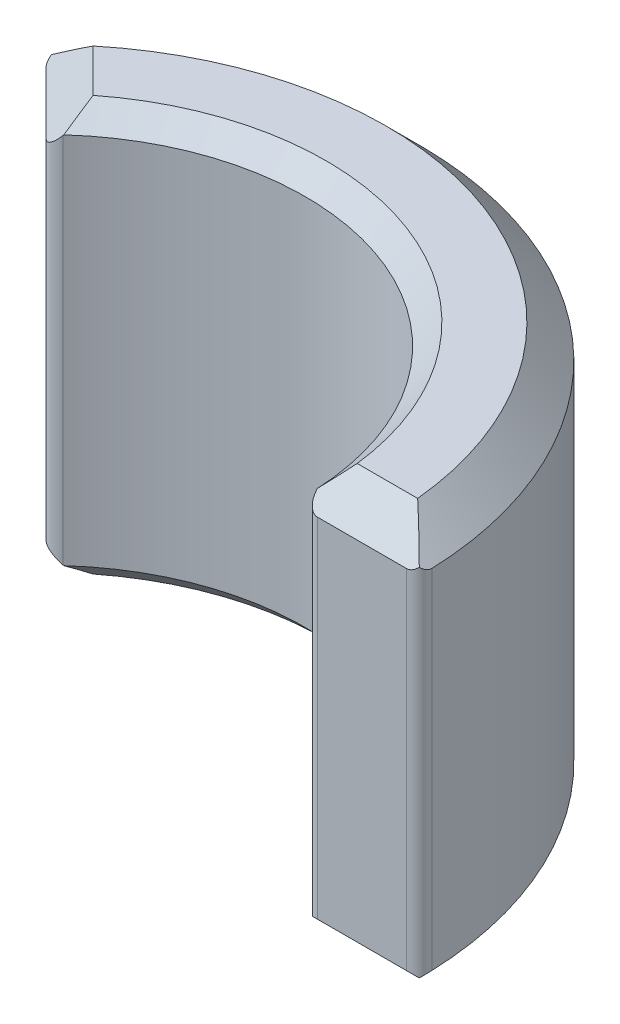
ISO-10303-21;
HEADER;
FILE_DESCRIPTION(('STEP AP214'),'2;1');
FILE_NAME('part.step','',(''),(''),'','','');
FILE_SCHEMA(('AUTOMOTIVE_DESIGN { 1 0 10303 214 1 1 1 1 }'));
ENDSEC;
DATA;
#1=APPLICATION_CONTEXT('core data for automotive mechanical design processes');
#2=APPLICATION_PROTOCOL_DEFINITION('international standard','automotive_design',2000,#1);
#3=PRODUCT_CONTEXT('',#1,'mechanical');
#4=PRODUCT('Part','Part','',(#3));
#5=PRODUCT_RELATED_PRODUCT_CATEGORY('part','',(#4));
#6=PRODUCT_DEFINITION_FORMATION('','',#4);
#7=PRODUCT_DEFINITION_CONTEXT('part definition',#1,'design');
#8=PRODUCT_DEFINITION('design','',#6,#7);
#9=PRODUCT_DEFINITION_SHAPE('','',#8);
#10=(LENGTH_UNIT() NAMED_UNIT(*) SI_UNIT(.MILLI.,.METRE.));
#11=(NAMED_UNIT(*) PLANE_ANGLE_UNIT() SI_UNIT($,.RADIAN.));
#12=(NAMED_UNIT(*) SI_UNIT($,.STERADIAN.) SOLID_ANGLE_UNIT());
#13=UNCERTAINTY_MEASURE_WITH_UNIT(LENGTH_MEASURE(1.E-05),#10,'distance_accuracy_value','');
#14=(GEOMETRIC_REPRESENTATION_CONTEXT(3) GLOBAL_UNCERTAINTY_ASSIGNED_CONTEXT((#13)) GLOBAL_UNIT_ASSIGNED_CONTEXT((#10,
#11,#12)) REPRESENTATION_CONTEXT('',''));
#15=CARTESIAN_POINT('',(0.,0.,0.));
#16=DIRECTION('',(0.,0.,1.));
#17=DIRECTION('',(1.,0.,0.));
#18=AXIS2_PLACEMENT_3D('',#15,#16,#17);
#19=CARTESIAN_POINT('',(-25.2874213562373,12.7,-1.31950983888535E-13));
#20=DIRECTION('',(0.,0.,-1.));
#21=DIRECTION('',(-1.,0.,0.));
#22=AXIS2_PLACEMENT_3D('',#19,#20,#21);
#23=PLANE('',#22);
#24=DIRECTION('',(-1.,0.,0.));
#25=VECTOR('',#24,1.);
#26=CARTESIAN_POINT('',(7.9375,11.684,0.));
#27=LINE('',#26,#25);
#28=CARTESIAN_POINT('',(11.0424290805964,11.684,0.));
#29=VERTEX_POINT('',#28);
#30=CARTESIAN_POINT('',(8.30977022847202,11.684,0.));
#31=VERTEX_POINT('',#30);
#32=EDGE_CURVE('E192',#29,#31,#27,.T.);
#33=ORIENTED_EDGE('',*,*,#32,.T.);
#34=DIRECTION('',(0.,1.,0.));
#35=VECTOR('',#34,1.);
#36=CARTESIAN_POINT('',(8.30977022847202,1.016,0.));
#37=LINE('',#36,#35);
#38=CARTESIAN_POINT('',(8.30977022847203,1.016,0.));
#39=VERTEX_POINT('',#38);
#40=EDGE_CURVE('E501',#31,#39,#37,.F.);
#41=ORIENTED_EDGE('',*,*,#40,.T.);
#42=DIRECTION('',(1.,0.,0.));
#43=VECTOR('',#42,1.);
#44=CARTESIAN_POINT('',(-25.2874213562373,1.016,-1.31950983888535E-13));
#45=LINE('',#44,#43);
#46=CARTESIAN_POINT('',(11.0424290805964,1.016,0.));
#47=VERTEX_POINT('',#46);
#48=EDGE_CURVE('E195',#39,#47,#45,.T.);
#49=ORIENTED_EDGE('',*,*,#48,.T.);
#50=DIRECTION('',(0.,-1.,0.));
#51=VECTOR('',#50,1.);
#52=CARTESIAN_POINT('',(11.0424290805964,12.7,0.));
#53=LINE('',#52,#51);
#54=EDGE_CURVE('E275',#47,#29,#53,.F.);
#55=ORIENTED_EDGE('',*,*,#54,.T.);
#56=EDGE_LOOP('',(#33,#41,#49,#55));
#57=FACE_BOUND('',#56,.T.);
#58=ADVANCED_FACE('F34',(#57),#23,.F.);
#59=CARTESIAN_POINT('',(0.,12.7,0.));
#60=DIRECTION('',(0.,-1.,0.));
#61=DIRECTION('',(0.,0.,-1.));
#62=AXIS2_PLACEMENT_3D('',#59,#60,#61);
#63=CYLINDRICAL_SURFACE('',#62,11.43);
#64=CARTESIAN_POINT('',(0.,11.684,0.));
#65=DIRECTION('',(0.,1.,0.));
#66=DIRECTION('',(0.,0.,1.));
#67=AXIS2_PLACEMENT_3D('',#64,#65,#66);
#68=CIRCLE('',#67,11.43);
#69=CARTESIAN_POINT('',(-7.79872634485773,11.684,-8.35612155237237));
#70=VERTEX_POINT('',#69);
#71=CARTESIAN_POINT('',(11.4232024971686,11.684,-0.394137931034423));
#72=VERTEX_POINT('',#71);
#73=EDGE_CURVE('E198',#70,#72,#68,.F.);
#74=ORIENTED_EDGE('',*,*,#73,.T.);
#75=DIRECTION('',(0.,-1.,0.));
#76=VECTOR('',#75,1.);
#77=CARTESIAN_POINT('',(11.4232024971686,12.7,-0.394137931034423));
#78=LINE('',#77,#76);
#79=CARTESIAN_POINT('',(11.4232024971686,1.016,-0.394137931034423));
#80=VERTEX_POINT('',#79);
#81=EDGE_CURVE('E343',#72,#80,#78,.T.);
#82=ORIENTED_EDGE('',*,*,#81,.T.);
#83=CARTESIAN_POINT('',(0.,1.016,0.));
#84=DIRECTION('',(0.,1.,0.));
#85=DIRECTION('',(0.,0.,1.));
#86=AXIS2_PLACEMENT_3D('',#83,#84,#85);
#87=CIRCLE('',#86,11.43);
#88=CARTESIAN_POINT('',(-7.79872634485773,1.016,-8.35612155237237));
#89=VERTEX_POINT('',#88);
#90=EDGE_CURVE('E201',#80,#89,#87,.T.);
#91=ORIENTED_EDGE('',*,*,#90,.T.);
#92=DIRECTION('',(0.,-1.,0.));
#93=VECTOR('',#92,1.);
#94=CARTESIAN_POINT('',(-7.79872634485773,12.7,-8.35612155237237));
#95=LINE('',#94,#93);
#96=EDGE_CURVE('E341',#89,#70,#95,.F.);
#97=ORIENTED_EDGE('',*,*,#96,.T.);
#98=EDGE_LOOP('',(#74,#82,#91,#97));
#99=FACE_BOUND('',#98,.T.);
#100=ADVANCED_FACE('F374',(#99),#63,.T.);
#101=CARTESIAN_POINT('',(-12.6437106781187,12.7,-12.6437106781187));
#102=DIRECTION('',(-0.707106781186548,0.,0.707106781186548));
#103=DIRECTION('',(0.707106781186548,0.,0.707106781186548));
#104=AXIS2_PLACEMENT_3D('',#101,#102,#103);
#105=PLANE('',#104);
#106=DIRECTION('',(-0.707106781186548,0.,-0.707106781186548));
#107=VECTOR('',#106,1.);
#108=CARTESIAN_POINT('',(-12.6437106781187,11.684,-12.6437106781187));
#109=LINE('',#108,#107);
#110=CARTESIAN_POINT('',(-5.87589487865465,11.684,-5.87589487865465));
#111=VERTEX_POINT('',#110);
#112=CARTESIAN_POINT('',(-7.80817648366121,11.684,-7.80817648366121));
#113=VERTEX_POINT('',#112);
#114=EDGE_CURVE('E169',#111,#113,#109,.T.);
#115=ORIENTED_EDGE('',*,*,#114,.T.);
#116=DIRECTION('',(0.,1.,0.));
#117=VECTOR('',#116,1.);
#118=CARTESIAN_POINT('',(-7.80817648366121,1.016,-7.80817648366122));
#119=LINE('',#118,#117);
#120=CARTESIAN_POINT('',(-7.80817648366121,1.016,-7.80817648366121));
#121=VERTEX_POINT('',#120);
#122=EDGE_CURVE('E321',#113,#121,#119,.F.);
#123=ORIENTED_EDGE('',*,*,#122,.T.);
#124=DIRECTION('',(0.707106781186548,0.,0.707106781186548));
#125=VECTOR('',#124,1.);
#126=CARTESIAN_POINT('',(-5.61266007566822,1.016,-5.61266007566822));
#127=LINE('',#126,#125);
#128=CARTESIAN_POINT('',(-5.87589487865465,1.016,-5.87589487865465));
#129=VERTEX_POINT('',#128);
#130=EDGE_CURVE('E180',#121,#129,#127,.T.);
#131=ORIENTED_EDGE('',*,*,#130,.T.);
#132=DIRECTION('',(0.,-1.,0.));
#133=VECTOR('',#132,1.);
#134=CARTESIAN_POINT('',(-5.87589487865466,12.7,-5.87589487865466));
#135=LINE('',#134,#133);
#136=EDGE_CURVE('E54',#129,#111,#135,.F.);
#137=ORIENTED_EDGE('',*,*,#136,.T.);
#138=EDGE_LOOP('',(#115,#123,#131,#137));
#139=FACE_BOUND('',#138,.T.);
#140=ADVANCED_FACE('F324',(#139),#105,.T.);
#141=CARTESIAN_POINT('',(0.,12.7,0.));
#142=DIRECTION('',(0.,-1.,0.));
#143=DIRECTION('',(0.,0.,-1.));
#144=AXIS2_PLACEMENT_3D('',#141,#142,#143);
#145=CYLINDRICAL_SURFACE('',#144,7.9375);
#146=CARTESIAN_POINT('',(0.,1.016,0.));
#147=DIRECTION('',(0.,0.707106781186549,-0.707106781186546));
#148=DIRECTION('',(0.,-0.707106781186546,-0.707106781186549));
#149=AXIS2_PLACEMENT_3D('',#146,#147,#148);
#150=ELLIPSE('',#149,11.2253201513364,7.9375);
#151=CARTESIAN_POINT('',(7.92835072697973,0.635000000000002,-0.380999999999959));
#152=VERTEX_POINT('',#151);
#153=CARTESIAN_POINT('',(7.9291700653359,0.652450381679392,-0.363549618320569));
#154=VERTEX_POINT('',#153);
#155=EDGE_CURVE('E187',#152,#154,#150,.F.);
#156=ORIENTED_EDGE('',*,*,#155,.T.);
#157=DIRECTION('',(0.,-1.,0.));
#158=VECTOR('',#157,1.);
#159=CARTESIAN_POINT('',(7.9291700653359,12.7,-0.363549618320569));
#160=LINE('',#159,#158);
#161=CARTESIAN_POINT('',(7.9291700653359,12.0475496183206,-0.36354961832057));
#162=VERTEX_POINT('',#161);
#163=EDGE_CURVE('E511',#154,#162,#160,.F.);
#164=ORIENTED_EDGE('',*,*,#163,.T.);
#165=CARTESIAN_POINT('',(0.,11.684,0.));
#166=DIRECTION('',(0.,0.707106781186547,0.707106781186548));
#167=DIRECTION('',(0.,-0.707106781186548,0.707106781186547));
#168=AXIS2_PLACEMENT_3D('',#165,#166,#167);
#169=ELLIPSE('',#168,11.2253201513364,7.9375);
#170=CARTESIAN_POINT('',(7.92835072697973,12.065,-0.380999999999964));
#171=VERTEX_POINT('',#170);
#172=EDGE_CURVE('E185',#162,#171,#169,.T.);
#173=ORIENTED_EDGE('',*,*,#172,.T.);
#174=CARTESIAN_POINT('',(0.,12.065,0.));
#175=DIRECTION('',(0.,1.,0.));
#176=DIRECTION('',(0.,0.,1.));
#177=AXIS2_PLACEMENT_3D('',#174,#175,#176);
#178=CIRCLE('',#177,7.9375);
#179=CARTESIAN_POINT('',(-5.33678287904058,12.065,-5.87559824630474));
#180=VERTEX_POINT('',#179);
#181=EDGE_CURVE('E239',#171,#180,#178,.T.);
#182=ORIENTED_EDGE('',*,*,#181,.T.);
#183=CARTESIAN_POINT('',(0.,11.684,0.));
#184=DIRECTION('',(0.5,-0.707106781186547,-0.5));
#185=DIRECTION('',(-0.5,-0.707106781186548,0.5));
#186=AXIS2_PLACEMENT_3D('',#183,#184,#185);
#187=ELLIPSE('',#186,11.2253201513364,7.9375);
#188=CARTESIAN_POINT('',(-5.34970152196811,12.0475496183206,-5.86383832279268));
#189=VERTEX_POINT('',#188);
#190=EDGE_CURVE('E182',#180,#189,#187,.F.);
#191=ORIENTED_EDGE('',*,*,#190,.T.);
#192=DIRECTION('',(0.,-1.,0.));
#193=VECTOR('',#192,1.);
#194=CARTESIAN_POINT('',(-5.34970152196811,12.7,-5.86383832279268));
#195=LINE('',#194,#193);
#196=CARTESIAN_POINT('',(-5.34970152196812,0.652450381679396,-5.86383832279268));
#197=VERTEX_POINT('',#196);
#198=EDGE_CURVE('E509',#189,#197,#195,.T.);
#199=ORIENTED_EDGE('',*,*,#198,.T.);
#200=CARTESIAN_POINT('',(0.,1.016,0.));
#201=DIRECTION('',(-0.5,-0.707106781186548,0.5));
#202=DIRECTION('',(0.5,-0.707106781186547,-0.5));
#203=AXIS2_PLACEMENT_3D('',#200,#201,#202);
#204=ELLIPSE('',#203,11.2253201513364,7.9375);
#205=CARTESIAN_POINT('',(-5.33678287904059,0.635000000000005,-5.87559824630473));
#206=VERTEX_POINT('',#205);
#207=EDGE_CURVE('E190',#197,#206,#204,.T.);
#208=ORIENTED_EDGE('',*,*,#207,.T.);
#209=CARTESIAN_POINT('',(0.,0.635000000000002,0.));
#210=DIRECTION('',(0.,1.,0.));
#211=DIRECTION('',(0.,0.,1.));
#212=AXIS2_PLACEMENT_3D('',#209,#210,#211);
#213=CIRCLE('',#212,7.9375);
#214=EDGE_CURVE('E262',#206,#152,#213,.F.);
#215=ORIENTED_EDGE('',*,*,#214,.T.);
#216=EDGE_LOOP('',(#156,#164,#173,#182,#191,#199,#208,#215));
#217=FACE_BOUND('',#216,.T.);
#218=ADVANCED_FACE('F307',(#217),#145,.F.);
#219=CARTESIAN_POINT('',(-25.2874213562373,12.7,0.));
#220=DIRECTION('',(0.,1.,0.));
#221=DIRECTION('',(0.,0.,1.));
#222=AXIS2_PLACEMENT_3D('',#219,#220,#221);
#223=PLANE('',#222);
#224=DIRECTION('',(0.707106781186548,0.,0.707106781186548));
#225=VECTOR('',#224,1.);
#226=CARTESIAN_POINT('',(-11.9252901884331,12.7,-13.3621311678042));
#227=LINE('',#226,#225);
#228=CARTESIAN_POINT('',(-6.61026083781124,12.7,-8.04710181718231));
#229=VERTEX_POINT('',#228);
#230=CARTESIAN_POINT('',(-5.30052876454481,12.7,-6.73736974391588));
#231=VERTEX_POINT('',#230);
#232=EDGE_CURVE('E207',#229,#231,#227,.T.);
#233=ORIENTED_EDGE('',*,*,#232,.T.);
#234=CARTESIAN_POINT('',(0.,12.7,0.));
#235=DIRECTION('',(0.,1.,0.));
#236=DIRECTION('',(0.,0.,1.));
#237=AXIS2_PLACEMENT_3D('',#234,#235,#236);
#238=CIRCLE('',#237,8.5725);
#239=CARTESIAN_POINT('',(8.51207966656798,12.7,-1.01599999999996));
#240=VERTEX_POINT('',#239);
#241=EDGE_CURVE('E267',#231,#240,#238,.F.);
#242=ORIENTED_EDGE('',*,*,#241,.T.);
#243=DIRECTION('',(1.,0.,0.));
#244=VECTOR('',#243,1.);
#245=CARTESIAN_POINT('',(11.43,12.7,-1.01599999999995));
#246=LINE('',#245,#244);
#247=CARTESIAN_POINT('',(10.3643205276564,12.7,-1.01599999999995));
#248=VERTEX_POINT('',#247);
#249=EDGE_CURVE('E210',#240,#248,#246,.T.);
#250=ORIENTED_EDGE('',*,*,#249,.T.);
#251=CARTESIAN_POINT('',(0.,12.7,0.));
#252=DIRECTION('',(0.,1.,0.));
#253=DIRECTION('',(0.,0.,1.));
#254=AXIS2_PLACEMENT_3D('',#251,#252,#253);
#255=CIRCLE('',#254,10.414);
#256=EDGE_CURVE('E204',#248,#229,#255,.T.);
#257=ORIENTED_EDGE('',*,*,#256,.T.);
#258=EDGE_LOOP('',(#233,#242,#250,#257));
#259=FACE_BOUND('',#258,.T.);
#260=ADVANCED_FACE('F298',(#259),#223,.T.);
#261=CARTESIAN_POINT('',(-25.2874213562373,0.,0.));
#262=DIRECTION('',(0.,1.,0.));
#263=DIRECTION('',(0.,0.,1.));
#264=AXIS2_PLACEMENT_3D('',#261,#262,#263);
#265=PLANE('',#264);
#266=DIRECTION('',(-1.,0.,0.));
#267=VECTOR('',#266,1.);
#268=CARTESIAN_POINT('',(-25.2874213562373,0.,-1.01600000000014));
#269=LINE('',#268,#267);
#270=CARTESIAN_POINT('',(10.3643205276564,0.,-1.01599999999995));
#271=VERTEX_POINT('',#270);
#272=CARTESIAN_POINT('',(8.51207966656798,0.,-1.01599999999996));
#273=VERTEX_POINT('',#272);
#274=EDGE_CURVE('E170',#271,#273,#269,.T.);
#275=ORIENTED_EDGE('',*,*,#274,.T.);
#276=CARTESIAN_POINT('',(0.,0.,0.));
#277=DIRECTION('',(0.,1.,0.));
#278=DIRECTION('',(0.,0.,1.));
#279=AXIS2_PLACEMENT_3D('',#276,#277,#278);
#280=CIRCLE('',#279,8.5725);
#281=CARTESIAN_POINT('',(-5.30052876454481,0.,-6.73736974391587));
#282=VERTEX_POINT('',#281);
#283=EDGE_CURVE('E168',#273,#282,#280,.T.);
#284=ORIENTED_EDGE('',*,*,#283,.T.);
#285=DIRECTION('',(-0.707106781186548,0.,-0.707106781186548));
#286=VECTOR('',#285,1.);
#287=CARTESIAN_POINT('',(-7.3638100192767,0.,-8.80065099864777));
#288=LINE('',#287,#286);
#289=CARTESIAN_POINT('',(-6.61026083781125,0.,-8.04710181718231));
#290=VERTEX_POINT('',#289);
#291=EDGE_CURVE('E152',#282,#290,#288,.T.);
#292=ORIENTED_EDGE('',*,*,#291,.T.);
#293=CARTESIAN_POINT('',(0.,0.,0.));
#294=DIRECTION('',(0.,1.,0.));
#295=DIRECTION('',(0.,0.,1.));
#296=AXIS2_PLACEMENT_3D('',#293,#294,#295);
#297=CIRCLE('',#296,10.414);
#298=EDGE_CURVE('E165',#290,#271,#297,.F.);
#299=ORIENTED_EDGE('',*,*,#298,.T.);
#300=EDGE_LOOP('',(#275,#284,#292,#299));
#301=FACE_BOUND('',#300,.T.);
#302=ADVANCED_FACE('F164',(#301),#265,.F.);
#303=CARTESIAN_POINT('',(-25.2874213562373,1.016,-1.31950983888535E-13));
#304=DIRECTION('',(0.,0.707106781186549,-0.707106781186546));
#305=DIRECTION('',(0.,0.707106781186546,0.707106781186549));
#306=AXIS2_PLACEMENT_3D('',#303,#304,#305);
#307=PLANE('',#306);
#308=ORIENTED_EDGE('',*,*,#48,.F.);
#309=CARTESIAN_POINT('',(8.30977022847203,0.635000000000002,-0.380999999999957));
#310=DIRECTION('',(0.,0.707106781186549,-0.707106781186546));
#311=DIRECTION('',(0.,-0.707106781186546,-0.707106781186549));
#312=AXIS2_PLACEMENT_3D('',#309,#310,#311);
#313=ELLIPSE('',#312,0.538815367264148,0.381);
#314=EDGE_CURVE('E318',#39,#154,#313,.F.);
#315=ORIENTED_EDGE('',*,*,#314,.T.);
#316=ORIENTED_EDGE('',*,*,#155,.F.);
#317=CARTESIAN_POINT('',(7.92835072697973,0.635000000000002,-0.380999999999959));
#318=CARTESIAN_POINT('',(7.97823697523159,0.582658534433013,-0.433341465566947));
#319=CARTESIAN_POINT('',(8.02779975670812,0.530163138012814,-0.485836861987145));
#320=CARTESIAN_POINT('',(8.12629534213918,0.424882602031652,-0.591117397968307));
#321=CARTESIAN_POINT('',(8.1752281873285,0.372097481761579,-0.643902518238381));
#322=CARTESIAN_POINT('',(8.27248710934797,0.266249058285938,-0.749750941714021));
#323=CARTESIAN_POINT('',(8.32081318999519,0.213185756833351,-0.802814243166608));
#324=CARTESIAN_POINT('',(8.41688090157139,0.106790339850935,-0.909209660149024));
#325=CARTESIAN_POINT('',(8.46462249383665,0.0534582068639063,-0.962541793136053));
#326=CARTESIAN_POINT('',(8.51207966656813,0.,-1.01599999999989));
#327=B_SPLINE_CURVE_WITH_KNOTS('',3,(#317,#318,#319,#320,#321,#322,#323,#324,#325,#326),
.UNSPECIFIED.,.F.,.F.,(4,2,2,2,4),(0.,0.267787995709505,0.535558372317782,0.803327063573637,
1.07111337296498),.UNSPECIFIED.);
#328=EDGE_CURVE('E256',#152,#273,#327,.T.);
#329=ORIENTED_EDGE('',*,*,#328,.T.);
#330=ORIENTED_EDGE('',*,*,#274,.F.);
#331=CARTESIAN_POINT('',(11.43,1.016,0.));
#332=CARTESIAN_POINT('',(11.3439178162953,0.929918832948133,-0.0860811670518073));
#333=CARTESIAN_POINT('',(11.2571881783209,0.844160635214496,-0.171839364785445));
#334=CARTESIAN_POINT('',(11.082393901889,0.67334521584951,-0.342654784150433));
#335=CARTESIAN_POINT('',(10.9943294476666,0.588287899937526,-0.427712100062418));
#336=CARTESIAN_POINT('',(10.8168005076827,0.418904355730044,-0.597095644269901));
#337=CARTESIAN_POINT('',(10.727335999586,0.334578139131308,-0.681421860868638));
#338=CARTESIAN_POINT('',(10.5469398583256,0.166695991917062,-0.849304008082886));
#339=CARTESIAN_POINT('',(10.4560080261044,0.0831401682707446,-0.932859831729204));
#340=CARTESIAN_POINT('',(10.3643205276564,0.,-1.01599999999995));
#341=B_SPLINE_CURVE_WITH_KNOTS('',3,(#331,#332,#333,#334,#335,#336,#337,#338,#339,#340),
.UNSPECIFIED.,.F.,.F.,(4,2,2,2,4),(0.,0.44729178359164,0.894522382946857,1.34176012433051,
1.78905905683944),.UNSPECIFIED.);
#342=CARTESIAN_POINT('',(11.3148153825376,0.901395762944445,-0.114604237055496));
#343=VERTEX_POINT('',#342);
#344=EDGE_CURVE('E157',#343,#271,#341,.T.);
#345=ORIENTED_EDGE('',*,*,#344,.F.);
#346=CARTESIAN_POINT('',(11.0424290805964,0.635000000000002,-0.380999999999942));
#347=DIRECTION('',(0.,0.707106781186549,-0.707106781186546));
#348=DIRECTION('',(0.,-0.707106781186546,-0.707106781186549));
#349=AXIS2_PLACEMENT_3D('',#346,#347,#348);
#350=ELLIPSE('',#349,0.538815367264148,0.381);
#351=EDGE_CURVE('E505',#343,#47,#350,.F.);
#352=ORIENTED_EDGE('',*,*,#351,.T.);
#353=EDGE_LOOP('',(#308,#315,#316,#329,#330,#345,#352));
#354=FACE_BOUND('',#353,.T.);
#355=ADVANCED_FACE('F227',(#354),#307,.F.);
#356=CARTESIAN_POINT('',(0.,1.016,0.));
#357=DIRECTION('',(0.,1.,0.));
#358=DIRECTION('',(0.,0.,1.));
#359=AXIS2_PLACEMENT_3D('',#356,#357,#358);
#360=CONICAL_SURFACE('',#359,11.43,0.78539816339745);
#361=ORIENTED_EDGE('',*,*,#90,.F.);
#362=CARTESIAN_POINT('',(11.4232024971686,1.016,-0.394137931034423));
#363=CARTESIAN_POINT('',(11.4238271685142,1.01602737926688,-0.376872001110282));
#364=CARTESIAN_POINT('',(11.4232201315012,1.01486594274378,-0.359604643390996));
#365=CARTESIAN_POINT('',(11.4197768407522,1.01041093664431,-0.32578117701592));
#366=CARTESIAN_POINT('',(11.4169674124446,1.00714310779595,-0.309219021536362));
#367=CARTESIAN_POINT('',(11.4093673993195,0.998721124466704,-0.277121172413615));
#368=CARTESIAN_POINT('',(11.4045816984263,0.993571623712139,-0.26158305708624));
#369=CARTESIAN_POINT('',(11.3933186938637,0.981664538514611,-0.231688857617281));
#370=CARTESIAN_POINT('',(11.3868317275464,0.97489778873461,-0.217340162236997));
#371=CARTESIAN_POINT('',(11.3706090050002,0.958125148740114,-0.186479102136176));
#372=CARTESIAN_POINT('',(11.3604676041493,0.94773558886536,-0.170393090237896));
#373=CARTESIAN_POINT('',(11.3386581334623,0.925521787065333,-0.140697408402816));
#374=CARTESIAN_POINT('',(11.3270055156511,0.91371214398988,-0.12706562281283));
#375=CARTESIAN_POINT('',(11.3148153825376,0.90139576294445,-0.11460423705549));
#376=B_SPLINE_CURVE_WITH_KNOTS('',3,(#362,#363,#364,#365,#366,#367,#368,#369,#370,#371,#372,
#373,#374,#375),.UNSPECIFIED.,.F.,.F.,(4,2,2,2,2,2,4),(0.,0.0516858659446514,0.102751791405072,
0.153692266761262,0.2049285811825,0.269667728538358,0.333790596221669),.UNSPECIFIED.);
#377=EDGE_CURVE('E342',#80,#343,#376,.T.);
#378=ORIENTED_EDGE('',*,*,#377,.T.);
#379=ORIENTED_EDGE('',*,*,#344,.T.);
#380=ORIENTED_EDGE('',*,*,#298,.F.);
#381=CARTESIAN_POINT('',(-6.61026083781125,0.,-8.04710181718231));
#382=CARTESIAN_POINT('',(-6.7338826664871,0.0831401682707446,-8.0531456923117));
#383=CARTESIAN_POINT('',(-6.85726407118432,0.166695991917062,-8.05836131799304));
#384=CARTESIAN_POINT('',(-7.10353401070479,0.334578139131308,-8.06721004804281));
#385=CARTESIAN_POINT('',(-7.2264226106443,0.418904355730045,-8.07084336880478));
#386=CARTESIAN_POINT('',(-7.47172678069428,0.588287899937527,-8.07660303339371));
#387=CARTESIAN_POINT('',(-7.59414235832732,0.673345215849511,-8.07872940128496));
#388=CARTESIAN_POINT('',(-7.83852531786911,0.844160635214497,-8.08154287809834));
#389=CARTESIAN_POINT('',(-7.96049263617045,0.929918832948133,-8.0822297900801));
#390=CARTESIAN_POINT('',(-8.08223050896224,1.016,-8.08223050896224));
#391=B_SPLINE_CURVE_WITH_KNOTS('',3,(#381,#382,#383,#384,#385,#386,#387,#388,#389,#390),
.UNSPECIFIED.,.F.,.F.,(4,2,2,2,4),(0.,0.447298932508925,0.89453667389258,1.3417672732478,
1.78905905683944),.UNSPECIFIED.);
#392=CARTESIAN_POINT('',(-7.91974525169152,0.901395762944448,-8.08182011804091));
#393=VERTEX_POINT('',#392);
#394=EDGE_CURVE('E147',#393,#290,#391,.F.);
#395=ORIENTED_EDGE('',*,*,#394,.F.);
#396=CARTESIAN_POINT('',(-7.91974525169152,0.901395762944449,-8.08182011804091));
#397=CARTESIAN_POINT('',(-7.91954784637645,0.914143904560735,-8.09986128280855));
#398=CARTESIAN_POINT('',(-7.91805450900517,0.926352247716841,-8.11838833275662));
#399=CARTESIAN_POINT('',(-7.91207448587439,0.949253704645095,-8.15615434508599));
#400=CARTESIAN_POINT('',(-7.90755570606788,0.959929065959037,-8.17539882880954));
#401=CARTESIAN_POINT('',(-7.89633489745238,0.977151371571971,-8.21014181832527));
#402=CARTESIAN_POINT('',(-7.89023702834095,0.98409733843468,-8.22563268859499));
#403=CARTESIAN_POINT('',(-7.87575377277536,0.996137790529297,-8.25614888314781));
#404=CARTESIAN_POINT('',(-7.86738333433087,1.00124388404221,-8.27117655897695));
#405=CARTESIAN_POINT('',(-7.84966156588829,1.0087555042864,-8.29833525460588));
#406=CARTESIAN_POINT('',(-7.84060317221126,1.01143574686045,-8.31058051905937));
#407=CARTESIAN_POINT('',(-7.8208488058441,1.01507603965453,-8.33416733405642));
#408=CARTESIAN_POINT('',(-7.81013702734281,1.01601821014319,-8.34549835701931));
#409=CARTESIAN_POINT('',(-7.79872634485773,1.016,-8.35612155237237));
#410=B_SPLINE_CURVE_WITH_KNOTS('',3,(#396,#397,#398,#399,#400,#401,#402,#403,#404,#405,#406,
#407,#408,#409),.UNSPECIFIED.,.F.,.F.,(4,2,2,2,2,2,4),(0.,0.0663807204866982,0.133477009218074,
0.187377507599557,0.240931718360044,0.287125323082728,0.333791531801178),.UNSPECIFIED.);
#411=EDGE_CURVE('E340',#393,#89,#410,.T.);
#412=ORIENTED_EDGE('',*,*,#411,.T.);
#413=EDGE_LOOP('',(#361,#378,#379,#380,#395,#412));
#414=FACE_BOUND('',#413,.T.);
#415=ADVANCED_FACE('F173',(#414),#360,.T.);
#416=CARTESIAN_POINT('',(-11.9252901884331,0.,-13.3621311678042));
#417=DIRECTION('',(-0.5,-0.707106781186548,0.5));
#418=DIRECTION('',(0.,-0.577350269189626,-0.816496580927726));
#419=AXIS2_PLACEMENT_3D('',#416,#417,#418);
#420=PLANE('',#419);
#421=ORIENTED_EDGE('',*,*,#130,.F.);
#422=CARTESIAN_POINT('',(-7.53876880002914,0.635,-8.07758416729329));
#423=DIRECTION('',(-0.5,-0.707106781186548,0.5));
#424=DIRECTION('',(0.5,-0.707106781186547,-0.5));
#425=AXIS2_PLACEMENT_3D('',#422,#423,#424);
#426=ELLIPSE('',#425,0.538815367264149,0.381);
#427=EDGE_CURVE('E153',#121,#393,#426,.T.);
#428=ORIENTED_EDGE('',*,*,#427,.T.);
#429=ORIENTED_EDGE('',*,*,#394,.T.);
#430=ORIENTED_EDGE('',*,*,#291,.F.);
#431=CARTESIAN_POINT('',(-5.30052876454481,0.,-6.73736974391588));
#432=CARTESIAN_POINT('',(-5.30477213647403,0.0534582068638797,-6.66601179467805));
#433=CARTESIAN_POINT('',(-5.30872524572893,0.106790339850927,-6.59454187815239));
#434=CARTESIAN_POINT('',(-5.3160280362558,0.213185756833357,-6.45137882700835));
#435=CARTESIAN_POINT('',(-5.31937775721124,0.26624905828594,-6.37968570738526));
#436=CARTESIAN_POINT('',(-5.3254514519379,0.372097481761576,-6.23606712607687));
#437=CARTESIAN_POINT('',(-5.32817542177049,0.424882602031648,-6.16414166293203));
#438=CARTESIAN_POINT('',(-5.3329731063145,0.530163138012817,-6.02005018563756));
#439=CARTESIAN_POINT('',(-5.3350467782278,0.582658534433023,-5.94788415597125));
#440=CARTESIAN_POINT('',(-5.33678287904064,0.635000000000025,-5.87559824630475));
#441=B_SPLINE_CURVE_WITH_KNOTS('',3,(#431,#432,#433,#434,#435,#436,#437,#438,#439,#440),
.UNSPECIFIED.,.F.,.F.,(4,2,2,2,4),(0.,0.267786309391341,0.535555000647197,0.803325377255472,
1.07111337296498),.UNSPECIFIED.);
#442=EDGE_CURVE('E232',#282,#206,#441,.T.);
#443=ORIENTED_EDGE('',*,*,#442,.T.);
#444=ORIENTED_EDGE('',*,*,#207,.F.);
#445=CARTESIAN_POINT('',(-5.60648719502258,0.635,-6.14530256228673));
#446=DIRECTION('',(-0.5,-0.707106781186548,0.5));
#447=DIRECTION('',(0.5,-0.707106781186547,-0.5));
#448=AXIS2_PLACEMENT_3D('',#445,#446,#447);
#449=ELLIPSE('',#448,0.538815367264149,0.381);
#450=EDGE_CURVE('E319',#197,#129,#449,.T.);
#451=ORIENTED_EDGE('',*,*,#450,.T.);
#452=EDGE_LOOP('',(#421,#428,#429,#430,#443,#444,#451));
#453=FACE_BOUND('',#452,.T.);
#454=ADVANCED_FACE('F150',(#453),#420,.T.);
#455=CARTESIAN_POINT('',(-12.6437106781187,11.684,-12.6437106781187));
#456=DIRECTION('',(0.5,-0.707106781186547,-0.5));
#457=DIRECTION('',(0.,0.577350269189626,-0.816496580927726));
#458=AXIS2_PLACEMENT_3D('',#455,#456,#457);
#459=PLANE('',#458);
#460=CARTESIAN_POINT('',(-8.08223050896224,11.684,-8.08223050896224));
#461=CARTESIAN_POINT('',(-7.96049263617045,11.7700811670519,-8.0822297900801));
#462=CARTESIAN_POINT('',(-7.83852531786911,11.8558393647855,-8.08154287809834));
#463=CARTESIAN_POINT('',(-7.59414235832731,12.0266547841505,-8.07872940128496));
#464=CARTESIAN_POINT('',(-7.47172678069428,12.1117121000625,-8.07660303339371));
#465=CARTESIAN_POINT('',(-7.2264226106443,12.28109564427,-8.07084336880478));
#466=CARTESIAN_POINT('',(-7.10353401070479,12.3654218608687,-8.06721004804281));
#467=CARTESIAN_POINT('',(-6.85726407118432,12.5333040080829,-8.05836131799304));
#468=CARTESIAN_POINT('',(-6.7338826664871,12.6168598317293,-8.0531456923117));
#469=CARTESIAN_POINT('',(-6.61026083781124,12.7,-8.04710181718231));
#470=B_SPLINE_CURVE_WITH_KNOTS('',3,(#460,#461,#462,#463,#464,#465,#466,#467,#468,#469),
.UNSPECIFIED.,.F.,.F.,(4,2,2,2,4),(0.,0.447291783591641,0.894522382946861,1.34176012433052,
1.78905905683945),.UNSPECIFIED.);
#471=CARTESIAN_POINT('',(-7.91974525169152,11.7986042370555,-8.08182011804091));
#472=VERTEX_POINT('',#471);
#473=EDGE_CURVE('E158',#472,#229,#470,.T.);
#474=ORIENTED_EDGE('',*,*,#473,.F.);
#475=CARTESIAN_POINT('',(-7.53876880002914,12.065,-8.07758416729329));
#476=DIRECTION('',(0.5,-0.707106781186547,-0.5));
#477=DIRECTION('',(-0.5,-0.707106781186548,0.5));
#478=AXIS2_PLACEMENT_3D('',#475,#476,#477);
#479=ELLIPSE('',#478,0.538815367264149,0.381);
#480=EDGE_CURVE('E11',#472,#113,#479,.F.);
#481=ORIENTED_EDGE('',*,*,#480,.T.);
#482=ORIENTED_EDGE('',*,*,#114,.F.);
#483=CARTESIAN_POINT('',(-5.60648719502258,12.065,-6.14530256228673));
#484=DIRECTION('',(0.5,-0.707106781186547,-0.5));
#485=DIRECTION('',(-0.5,-0.707106781186548,0.5));
#486=AXIS2_PLACEMENT_3D('',#483,#484,#485);
#487=ELLIPSE('',#486,0.538815367264149,0.381);
#488=EDGE_CURVE('E42',#111,#189,#487,.F.);
#489=ORIENTED_EDGE('',*,*,#488,.T.);
#490=ORIENTED_EDGE('',*,*,#190,.F.);
#491=CARTESIAN_POINT('',(-5.33678287904058,12.065,-5.87559824630474));
#492=CARTESIAN_POINT('',(-5.33504677822777,12.117341465567,-5.94788415597125));
#493=CARTESIAN_POINT('',(-5.33297310631449,12.1698368619872,-6.02005018563756));
#494=CARTESIAN_POINT('',(-5.32817542177049,12.2751173979683,-6.16414166293204));
#495=CARTESIAN_POINT('',(-5.3254514519379,12.3279025182384,-6.23606712607687));
#496=CARTESIAN_POINT('',(-5.31937775721123,12.4337509417141,-6.37968570738526));
#497=CARTESIAN_POINT('',(-5.31602803625577,12.4868142431666,-6.45137882700835));
#498=CARTESIAN_POINT('',(-5.30872524572894,12.5932096601491,-6.59454187815239));
#499=CARTESIAN_POINT('',(-5.30477213647408,12.6465417931361,-6.66601179467807));
#500=CARTESIAN_POINT('',(-5.30052876454496,12.6999999999999,-6.73736974391593));
#501=B_SPLINE_CURVE_WITH_KNOTS('',3,(#491,#492,#493,#494,#495,#496,#497,#498,#499,#500),
.UNSPECIFIED.,.F.,.F.,(4,2,2,2,4),(0.,0.267787995709503,0.535558372317777,0.803327063573629,
1.07111337296497),.UNSPECIFIED.);
#502=EDGE_CURVE('E261',#180,#231,#501,.T.);
#503=ORIENTED_EDGE('',*,*,#502,.T.);
#504=ORIENTED_EDGE('',*,*,#232,.F.);
#505=EDGE_LOOP('',(#474,#481,#482,#489,#490,#503,#504));
#506=FACE_BOUND('',#505,.T.);
#507=ADVANCED_FACE('F226',(#506),#459,.F.);
#508=CARTESIAN_POINT('',(0.,12.7,0.));
#509=DIRECTION('',(0.,-1.,0.));
#510=DIRECTION('',(0.,0.,-1.));
#511=AXIS2_PLACEMENT_3D('',#508,#509,#510);
#512=CONICAL_SURFACE('',#511,10.414,0.785398163397447);
#513=CARTESIAN_POINT('',(10.3643205276564,12.7,-1.01599999999995));
#514=CARTESIAN_POINT('',(10.4560080261044,12.6168598317293,-0.932859831729206));
#515=CARTESIAN_POINT('',(10.5469398583256,12.5333040080829,-0.849304008082888));
#516=CARTESIAN_POINT('',(10.727335999586,12.3654218608687,-0.681421860868639));
#517=CARTESIAN_POINT('',(10.8168005076827,12.28109564427,-0.597095644269902));
#518=CARTESIAN_POINT('',(10.9943294476666,12.1117121000625,-0.427712100062418));
#519=CARTESIAN_POINT('',(11.082393901889,12.0266547841505,-0.342654784150433));
#520=CARTESIAN_POINT('',(11.2571881783209,11.8558393647855,-0.171839364785445));
#521=CARTESIAN_POINT('',(11.3439178162953,11.7700811670519,-0.0860811670518072));
#522=CARTESIAN_POINT('',(11.43,11.684,0.));
#523=B_SPLINE_CURVE_WITH_KNOTS('',3,(#513,#514,#515,#516,#517,#518,#519,#520,#521,#522),
.UNSPECIFIED.,.F.,.F.,(4,2,2,2,4),(0.,0.447298932508928,0.894536673892584,1.3417672732478,
1.78905905683945),.UNSPECIFIED.);
#524=CARTESIAN_POINT('',(11.3148153825376,11.7986042370555,-0.114604237055494));
#525=VERTEX_POINT('',#524);
#526=EDGE_CURVE('E283',#525,#248,#523,.F.);
#527=ORIENTED_EDGE('',*,*,#526,.F.);
#528=CARTESIAN_POINT('',(11.3148153825376,11.7986042370555,-0.114604237055493));
#529=CARTESIAN_POINT('',(11.3274328258484,11.7858560954393,-0.127500853640125));
#530=CARTESIAN_POINT('',(11.3394774795202,11.7736477522832,-0.141657405275621));
#531=CARTESIAN_POINT('',(11.3619535680293,11.7507462953549,-0.172590523599526));
#532=CARTESIAN_POINT('',(11.3723662131268,11.740070934041,-0.189393688384757));
#533=CARTESIAN_POINT('',(11.3889989067496,11.722848628428,-0.221895001732431));
#534=CARTESIAN_POINT('',(11.3956407615643,11.7159026615653,-0.237160545746116));
#535=CARTESIAN_POINT('',(11.4069777614445,11.7038622094707,-0.268979962074506));
#536=CARTESIAN_POINT('',(11.4116851391432,11.6987561159578,-0.285524927344361));
#537=CARTESIAN_POINT('',(11.4183580543502,11.6912444957136,-0.317260207832131));
#538=CARTESIAN_POINT('',(11.420611512287,11.6885642531395,-0.332324168960299));
#539=CARTESIAN_POINT('',(11.4233214627018,11.6849239603455,-0.362971012207575));
#540=CARTESIAN_POINT('',(11.4237593346598,11.6839817898568,-0.378557626599247));
#541=CARTESIAN_POINT('',(11.4232024971686,11.684,-0.394137931034423));
#542=B_SPLINE_CURVE_WITH_KNOTS('',3,(#528,#529,#530,#531,#532,#533,#534,#535,#536,#537,#538,
#539,#540,#541),.UNSPECIFIED.,.F.,.F.,(4,2,2,2,2,2,4),(0.,0.0663807204866986,0.133477009218077,
0.187377507599557,0.240931718360043,0.287125323082727,0.333791531801181),.UNSPECIFIED.);
#543=EDGE_CURVE('E327',#525,#72,#542,.T.);
#544=ORIENTED_EDGE('',*,*,#543,.T.);
#545=ORIENTED_EDGE('',*,*,#73,.F.);
#546=CARTESIAN_POINT('',(-7.79872634485773,11.684,-8.35612155237237));
#547=CARTESIAN_POINT('',(-7.81137691033502,11.6839726207331,-8.34435440558395));
#548=CARTESIAN_POINT('',(-7.82315753608323,11.6851340572562,-8.3317152998592));
#549=CARTESIAN_POINT('',(-7.844639564282,11.6895890633557,-8.30536372318387));
#550=CARTESIAN_POINT('',(-7.85436421092513,11.692856892204,-8.29166594492567));
#551=CARTESIAN_POINT('',(-7.87168679688347,11.7012788755333,-8.26359531733162));
#552=CARTESIAN_POINT('',(-7.87928990204398,11.7064283762879,-8.24922420906244));
#553=CARTESIAN_POINT('',(-7.89246414630388,11.7183354614854,-8.22012167099704));
#554=CARTESIAN_POINT('',(-7.89802322823617,11.7251022112654,-8.20538863332018));
#555=CARTESIAN_POINT('',(-7.90837409598632,11.7418748512599,-8.17209537132654));
#556=CARTESIAN_POINT('',(-7.91257757076945,11.7522644111346,-8.15354978991863));
#557=CARTESIAN_POINT('',(-7.91815396415017,11.7744782129347,-8.11713014730426));
#558=CARTESIAN_POINT('',(-7.91955344710762,11.7862878560101,-8.09925137420099));
#559=CARTESIAN_POINT('',(-7.91974525169153,11.7986042370555,-8.08182011804091));
#560=B_SPLINE_CURVE_WITH_KNOTS('',3,(#546,#547,#548,#549,#550,#551,#552,#553,#554,#555,#556,
#557,#558,#559),.UNSPECIFIED.,.F.,.F.,(4,2,2,2,2,2,4),(0.,0.0516858659446523,0.102751791405073,
0.153692266761264,0.204928581182503,0.269667728538358,0.333790596221668),.UNSPECIFIED.);
#561=EDGE_CURVE('E295',#70,#472,#560,.T.);
#562=ORIENTED_EDGE('',*,*,#561,.T.);
#563=ORIENTED_EDGE('',*,*,#473,.T.);
#564=ORIENTED_EDGE('',*,*,#256,.F.);
#565=EDGE_LOOP('',(#527,#544,#545,#562,#563,#564));
#566=FACE_BOUND('',#565,.T.);
#567=ADVANCED_FACE('F279',(#566),#512,.T.);
#568=CARTESIAN_POINT('',(-25.2874213562373,12.7,-1.01600000000014));
#569=DIRECTION('',(0.,0.707106781186547,0.707106781186548));
#570=DIRECTION('',(0.,-0.707106781186548,0.707106781186547));
#571=AXIS2_PLACEMENT_3D('',#568,#569,#570);
#572=PLANE('',#571);
#573=ORIENTED_EDGE('',*,*,#172,.F.);
#574=CARTESIAN_POINT('',(8.30977022847203,12.065,-0.380999999999957));
#575=DIRECTION('',(0.,0.707106781186547,0.707106781186548));
#576=DIRECTION('',(0.,-0.707106781186548,0.707106781186547));
#577=AXIS2_PLACEMENT_3D('',#574,#575,#576);
#578=ELLIPSE('',#577,0.538815367264149,0.381);
#579=EDGE_CURVE('E504',#162,#31,#578,.T.);
#580=ORIENTED_EDGE('',*,*,#579,.T.);
#581=ORIENTED_EDGE('',*,*,#32,.F.);
#582=CARTESIAN_POINT('',(11.0424290805964,12.065,-0.380999999999942));
#583=DIRECTION('',(0.,0.707106781186547,0.707106781186548));
#584=DIRECTION('',(0.,-0.707106781186548,0.707106781186547));
#585=AXIS2_PLACEMENT_3D('',#582,#583,#584);
#586=ELLIPSE('',#585,0.538815367264149,0.381);
#587=EDGE_CURVE('E513',#29,#525,#586,.T.);
#588=ORIENTED_EDGE('',*,*,#587,.T.);
#589=ORIENTED_EDGE('',*,*,#526,.T.);
#590=ORIENTED_EDGE('',*,*,#249,.F.);
#591=CARTESIAN_POINT('',(8.51207966656798,12.7,-1.01599999999996));
#592=CARTESIAN_POINT('',(8.46462249383659,12.6465417931361,-0.962541793136083));
#593=CARTESIAN_POINT('',(8.41688090157137,12.5932096601491,-0.909209660149036));
#594=CARTESIAN_POINT('',(8.3208131899952,12.4868142431666,-0.802814243166606));
#595=CARTESIAN_POINT('',(8.27248710934797,12.4337509417141,-0.749750941714023));
#596=CARTESIAN_POINT('',(8.17522818732849,12.3279025182384,-0.643902518238388));
#597=CARTESIAN_POINT('',(8.12629534213917,12.2751173979684,-0.591117397968316));
#598=CARTESIAN_POINT('',(8.02779975670813,12.1698368619872,-0.485836861987149));
#599=CARTESIAN_POINT('',(7.97823697523162,12.117341465567,-0.433341465566944));
#600=CARTESIAN_POINT('',(7.92835072697978,12.065,-0.380999999999941));
#601=B_SPLINE_CURVE_WITH_KNOTS('',3,(#591,#592,#593,#594,#595,#596,#597,#598,#599,#600),
.UNSPECIFIED.,.F.,.F.,(4,2,2,2,4),(0.,0.267786309391341,0.535555000647195,0.80332537725547,
1.07111337296497),.UNSPECIFIED.);
#602=EDGE_CURVE('E269',#240,#171,#601,.T.);
#603=ORIENTED_EDGE('',*,*,#602,.T.);
#604=EDGE_LOOP('',(#573,#580,#581,#588,#589,#590,#603));
#605=FACE_BOUND('',#604,.T.);
#606=ADVANCED_FACE('F248',(#605),#572,.T.);
#607=CARTESIAN_POINT('',(0.,0.,0.));
#608=DIRECTION('',(0.,-1.,0.));
#609=DIRECTION('',(0.,0.,-1.));
#610=AXIS2_PLACEMENT_3D('',#607,#608,#609);
#611=CONICAL_SURFACE('',#610,8.5725,0.785398163397448);
#612=ORIENTED_EDGE('',*,*,#328,.F.);
#613=ORIENTED_EDGE('',*,*,#214,.F.);
#614=ORIENTED_EDGE('',*,*,#442,.F.);
#615=ORIENTED_EDGE('',*,*,#283,.F.);
#616=EDGE_LOOP('',(#612,#613,#614,#615));
#617=FACE_BOUND('',#616,.T.);
#618=ADVANCED_FACE('F242',(#617),#611,.F.);
#619=CARTESIAN_POINT('',(0.,12.065,0.));
#620=DIRECTION('',(0.,1.,0.));
#621=DIRECTION('',(0.,0.,1.));
#622=AXIS2_PLACEMENT_3D('',#619,#620,#621);
#623=CONICAL_SURFACE('',#622,7.9375,0.785398163397448);
#624=ORIENTED_EDGE('',*,*,#602,.F.);
#625=ORIENTED_EDGE('',*,*,#241,.F.);
#626=ORIENTED_EDGE('',*,*,#502,.F.);
#627=ORIENTED_EDGE('',*,*,#181,.F.);
#628=EDGE_LOOP('',(#624,#625,#626,#627));
#629=FACE_BOUND('',#628,.T.);
#630=ADVANCED_FACE('F247',(#629),#623,.F.);
#631=CARTESIAN_POINT('',(8.30977022847203,12.7,-0.380999999999957));
#632=DIRECTION('',(0.,-1.,0.));
#633=DIRECTION('',(0.,0.,-1.));
#634=AXIS2_PLACEMENT_3D('',#631,#632,#633);
#635=CYLINDRICAL_SURFACE('',#634,0.381);
#636=ORIENTED_EDGE('',*,*,#579,.F.);
#637=ORIENTED_EDGE('',*,*,#163,.F.);
#638=ORIENTED_EDGE('',*,*,#314,.F.);
#639=ORIENTED_EDGE('',*,*,#40,.F.);
#640=EDGE_LOOP('',(#636,#637,#638,#639));
#641=FACE_BOUND('',#640,.T.);
#642=ADVANCED_FACE('F364',(#641),#635,.T.);
#643=CARTESIAN_POINT('',(11.0424290805964,12.7,-0.380999999999942));
#644=DIRECTION('',(0.,-1.,0.));
#645=DIRECTION('',(0.,0.,-1.));
#646=AXIS2_PLACEMENT_3D('',#643,#644,#645);
#647=CYLINDRICAL_SURFACE('',#646,0.381);
#648=ORIENTED_EDGE('',*,*,#587,.F.);
#649=ORIENTED_EDGE('',*,*,#54,.F.);
#650=ORIENTED_EDGE('',*,*,#351,.F.);
#651=ORIENTED_EDGE('',*,*,#377,.F.);
#652=ORIENTED_EDGE('',*,*,#81,.F.);
#653=ORIENTED_EDGE('',*,*,#543,.F.);
#654=EDGE_LOOP('',(#648,#649,#650,#651,#652,#653));
#655=FACE_BOUND('',#654,.T.);
#656=ADVANCED_FACE('F357',(#655),#647,.T.);
#657=CARTESIAN_POINT('',(-7.53876880002914,12.7,-8.07758416729329));
#658=DIRECTION('',(0.,-1.,0.));
#659=DIRECTION('',(0.,0.,-1.));
#660=AXIS2_PLACEMENT_3D('',#657,#658,#659);
#661=CYLINDRICAL_SURFACE('',#660,0.381);
#662=ORIENTED_EDGE('',*,*,#561,.F.);
#663=ORIENTED_EDGE('',*,*,#96,.F.);
#664=ORIENTED_EDGE('',*,*,#411,.F.);
#665=ORIENTED_EDGE('',*,*,#427,.F.);
#666=ORIENTED_EDGE('',*,*,#122,.F.);
#667=ORIENTED_EDGE('',*,*,#480,.F.);
#668=EDGE_LOOP('',(#662,#663,#664,#665,#666,#667));
#669=FACE_BOUND('',#668,.T.);
#670=ADVANCED_FACE('F338',(#669),#661,.T.);
#671=CARTESIAN_POINT('',(-5.60648719502258,12.7,-6.14530256228673));
#672=DIRECTION('',(0.,-1.,0.));
#673=DIRECTION('',(0.,0.,-1.));
#674=AXIS2_PLACEMENT_3D('',#671,#672,#673);
#675=CYLINDRICAL_SURFACE('',#674,0.381);
#676=ORIENTED_EDGE('',*,*,#488,.F.);
#677=ORIENTED_EDGE('',*,*,#136,.F.);
#678=ORIENTED_EDGE('',*,*,#450,.F.);
#679=ORIENTED_EDGE('',*,*,#198,.F.);
#680=EDGE_LOOP('',(#676,#677,#678,#679));
#681=FACE_BOUND('',#680,.T.);
#682=ADVANCED_FACE('F36',(#681),#675,.T.);
#683=CLOSED_SHELL('',(#58,#100,#140,#218,#260,#302,#355,#415,#454,#507,#567,#606,#618,#630,#642,
#656,#670,#682));
#684=MANIFOLD_SOLID_BREP('B2',#683);
#685=ADVANCED_BREP_SHAPE_REPRESENTATION('',(#18,#684),#14);
#686=SHAPE_DEFINITION_REPRESENTATION(#9,#685);
ENDSEC;
END-ISO-10303-21;
